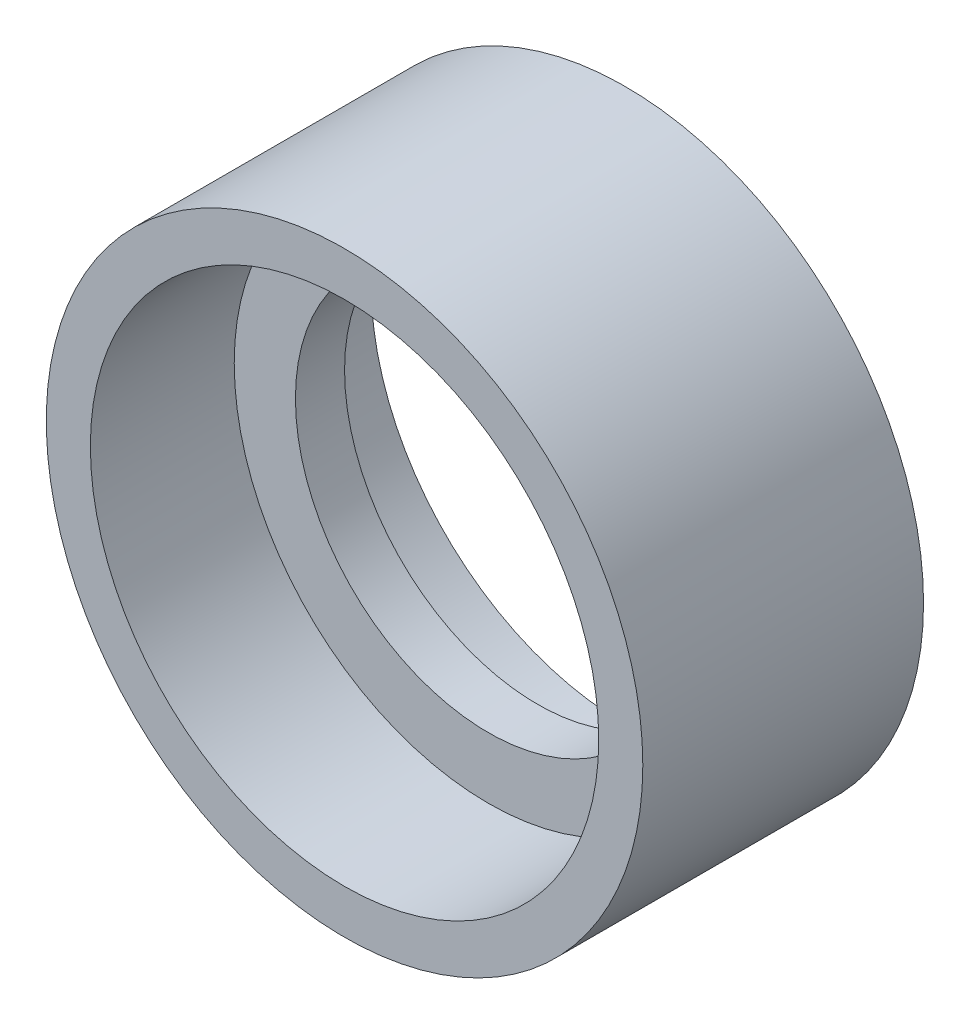
ISO-10303-21;
HEADER;
FILE_DESCRIPTION(('STEP AP214'),'2;1');
FILE_NAME('part.step','',(''),(''),'','','');
FILE_SCHEMA(('AUTOMOTIVE_DESIGN { 1 0 10303 214 1 1 1 1 }'));
ENDSEC;
DATA;
#1=APPLICATION_CONTEXT('core data for automotive mechanical design processes');
#2=APPLICATION_PROTOCOL_DEFINITION('international standard','automotive_design',2000,#1);
#3=PRODUCT_CONTEXT('',#1,'mechanical');
#4=PRODUCT('Part','Part','',(#3));
#5=PRODUCT_RELATED_PRODUCT_CATEGORY('part','',(#4));
#6=PRODUCT_DEFINITION_FORMATION('','',#4);
#7=PRODUCT_DEFINITION_CONTEXT('part definition',#1,'design');
#8=PRODUCT_DEFINITION('design','',#6,#7);
#9=PRODUCT_DEFINITION_SHAPE('','',#8);
#10=(LENGTH_UNIT() NAMED_UNIT(*) SI_UNIT(.MILLI.,.METRE.));
#11=(NAMED_UNIT(*) PLANE_ANGLE_UNIT() SI_UNIT($,.RADIAN.));
#12=(NAMED_UNIT(*) SI_UNIT($,.STERADIAN.) SOLID_ANGLE_UNIT());
#13=UNCERTAINTY_MEASURE_WITH_UNIT(LENGTH_MEASURE(1.E-05),#10,'distance_accuracy_value','');
#14=(GEOMETRIC_REPRESENTATION_CONTEXT(3) GLOBAL_UNCERTAINTY_ASSIGNED_CONTEXT((#13)) GLOBAL_UNIT_ASSIGNED_CONTEXT((#10,
#11,#12)) REPRESENTATION_CONTEXT('',''));
#15=CARTESIAN_POINT('',(0.,0.,0.));
#16=DIRECTION('',(0.,0.,1.));
#17=DIRECTION('',(1.,0.,0.));
#18=AXIS2_PLACEMENT_3D('',#15,#16,#17);
#19=CARTESIAN_POINT('',(0.,0.,12.7));
#20=DIRECTION('',(0.,0.,-1.));
#21=DIRECTION('',(-1.,0.,0.));
#22=AXIS2_PLACEMENT_3D('',#19,#20,#21);
#23=CYLINDRICAL_SURFACE('',#22,11.5);
#24=CARTESIAN_POINT('',(0.,0.,12.7));
#25=DIRECTION('',(0.,0.,-1.));
#26=DIRECTION('',(-1.,0.,0.));
#27=AXIS2_PLACEMENT_3D('',#24,#25,#26);
#28=CIRCLE('',#27,11.5);
#29=CARTESIAN_POINT('',(-11.5,0.,12.7));
#30=VERTEX_POINT('',#29);
#31=EDGE_CURVE('E51',#30,#30,#28,.T.);
#32=ORIENTED_EDGE('',*,*,#31,.F.);
#33=EDGE_LOOP('',(#32));
#34=FACE_BOUND('',#33,.T.);
#35=CARTESIAN_POINT('',(0.,0.,6.19125));
#36=DIRECTION('',(0.,0.,-1.));
#37=DIRECTION('',(-1.,0.,0.));
#38=AXIS2_PLACEMENT_3D('',#35,#36,#37);
#39=CIRCLE('',#38,11.5);
#40=CARTESIAN_POINT('',(-11.5,0.,6.19125));
#41=VERTEX_POINT('',#40);
#42=EDGE_CURVE('E10',#41,#41,#39,.F.);
#43=ORIENTED_EDGE('',*,*,#42,.F.);
#44=EDGE_LOOP('',(#43));
#45=FACE_BOUND('',#44,.T.);
#46=ADVANCED_FACE('F35',(#34,#45),#23,.F.);
#47=CARTESIAN_POINT('',(0.,0.,12.7));
#48=DIRECTION('',(0.,0.,-1.));
#49=DIRECTION('',(-1.,0.,0.));
#50=AXIS2_PLACEMENT_3D('',#47,#48,#49);
#51=CYLINDRICAL_SURFACE('',#50,13.49375);
#52=CARTESIAN_POINT('',(0.,0.,12.7));
#53=DIRECTION('',(0.,0.,1.));
#54=DIRECTION('',(1.,0.,0.));
#55=AXIS2_PLACEMENT_3D('',#52,#53,#54);
#56=CIRCLE('',#55,13.49375);
#57=CARTESIAN_POINT('',(13.49375,0.,12.7));
#58=VERTEX_POINT('',#57);
#59=EDGE_CURVE('E43',#58,#58,#56,.T.);
#60=ORIENTED_EDGE('',*,*,#59,.F.);
#61=EDGE_LOOP('',(#60));
#62=FACE_BOUND('',#61,.T.);
#63=CARTESIAN_POINT('',(0.,0.,0.));
#64=DIRECTION('',(0.,0.,1.));
#65=DIRECTION('',(1.,0.,0.));
#66=AXIS2_PLACEMENT_3D('',#63,#64,#65);
#67=CIRCLE('',#66,13.49375);
#68=CARTESIAN_POINT('',(13.49375,0.,0.));
#69=VERTEX_POINT('',#68);
#70=EDGE_CURVE('E47',#69,#69,#67,.T.);
#71=ORIENTED_EDGE('',*,*,#70,.T.);
#72=EDGE_LOOP('',(#71));
#73=FACE_BOUND('',#72,.T.);
#74=ADVANCED_FACE('F37',(#62,#73),#51,.T.);
#75=CARTESIAN_POINT('',(0.,0.,12.7));
#76=DIRECTION('',(0.,0.,1.));
#77=DIRECTION('',(1.,0.,0.));
#78=AXIS2_PLACEMENT_3D('',#75,#76,#77);
#79=PLANE('',#78);
#80=ORIENTED_EDGE('',*,*,#31,.T.);
#81=EDGE_LOOP('',(#80));
#82=FACE_BOUND('',#81,.T.);
#83=ORIENTED_EDGE('',*,*,#59,.T.);
#84=EDGE_LOOP('',(#83));
#85=FACE_BOUND('',#84,.T.);
#86=ADVANCED_FACE('F86',(#82,#85),#79,.T.);
#87=CARTESIAN_POINT('',(0.,0.,0.));
#88=DIRECTION('',(0.,0.,1.));
#89=DIRECTION('',(1.,0.,0.));
#90=AXIS2_PLACEMENT_3D('',#87,#88,#89);
#91=PLANE('',#90);
#92=CARTESIAN_POINT('',(0.,0.,0.));
#93=DIRECTION('',(0.,0.,-1.));
#94=DIRECTION('',(-1.,0.,0.));
#95=AXIS2_PLACEMENT_3D('',#92,#93,#94);
#96=CIRCLE('',#95,11.5);
#97=CARTESIAN_POINT('',(-11.5,0.,0.));
#98=VERTEX_POINT('',#97);
#99=EDGE_CURVE('E53',#98,#98,#96,.T.);
#100=ORIENTED_EDGE('',*,*,#99,.F.);
#101=EDGE_LOOP('',(#100));
#102=FACE_BOUND('',#101,.T.);
#103=ORIENTED_EDGE('',*,*,#70,.F.);
#104=EDGE_LOOP('',(#103));
#105=FACE_BOUND('',#104,.T.);
#106=ADVANCED_FACE('F80',(#102,#105),#91,.F.);
#107=CARTESIAN_POINT('',(0.,0.,3.96875));
#108=DIRECTION('',(0.,0.,-1.));
#109=DIRECTION('',(-1.,0.,0.));
#110=AXIS2_PLACEMENT_3D('',#107,#108,#109);
#111=CIRCLE('',#110,11.5);
#112=CARTESIAN_POINT('',(-11.5,0.,3.96875));
#113=VERTEX_POINT('',#112);
#114=EDGE_CURVE('E56',#113,#113,#111,.T.);
#115=ORIENTED_EDGE('',*,*,#114,.F.);
#116=EDGE_LOOP('',(#115));
#117=FACE_BOUND('',#116,.T.);
#118=ORIENTED_EDGE('',*,*,#99,.T.);
#119=EDGE_LOOP('',(#118));
#120=FACE_BOUND('',#119,.T.);
#121=ADVANCED_FACE('F74',(#117,#120),#23,.F.);
#122=CARTESIAN_POINT('',(0.,0.,3.96875));
#123=DIRECTION('',(0.,0.,-1.));
#124=DIRECTION('',(-1.,0.,0.));
#125=AXIS2_PLACEMENT_3D('',#122,#123,#124);
#126=PLANE('',#125);
#127=CARTESIAN_POINT('',(0.,0.,3.96875));
#128=DIRECTION('',(0.,0.,-1.));
#129=DIRECTION('',(-1.,0.,0.));
#130=AXIS2_PLACEMENT_3D('',#127,#128,#129);
#131=CIRCLE('',#130,8.73125);
#132=CARTESIAN_POINT('',(-8.73125,0.,3.96875));
#133=VERTEX_POINT('',#132);
#134=EDGE_CURVE('E39',#133,#133,#131,.T.);
#135=ORIENTED_EDGE('',*,*,#134,.F.);
#136=EDGE_LOOP('',(#135));
#137=FACE_BOUND('',#136,.T.);
#138=ORIENTED_EDGE('',*,*,#114,.T.);
#139=EDGE_LOOP('',(#138));
#140=FACE_BOUND('',#139,.T.);
#141=ADVANCED_FACE('F70',(#137,#140),#126,.T.);
#142=CARTESIAN_POINT('',(0.,0.,6.19125));
#143=DIRECTION('',(0.,0.,-1.));
#144=DIRECTION('',(-1.,0.,0.));
#145=AXIS2_PLACEMENT_3D('',#142,#143,#144);
#146=PLANE('',#145);
#147=CARTESIAN_POINT('',(0.,0.,6.19125));
#148=DIRECTION('',(0.,0.,1.));
#149=DIRECTION('',(1.,0.,0.));
#150=AXIS2_PLACEMENT_3D('',#147,#148,#149);
#151=CIRCLE('',#150,8.73125);
#152=CARTESIAN_POINT('',(8.73125,0.,6.19125));
#153=VERTEX_POINT('',#152);
#154=EDGE_CURVE('E61',#153,#153,#151,.T.);
#155=ORIENTED_EDGE('',*,*,#154,.F.);
#156=EDGE_LOOP('',(#155));
#157=FACE_BOUND('',#156,.T.);
#158=ORIENTED_EDGE('',*,*,#42,.T.);
#159=EDGE_LOOP('',(#158));
#160=FACE_BOUND('',#159,.T.);
#161=ADVANCED_FACE('F73',(#157,#160),#146,.F.);
#162=CARTESIAN_POINT('',(0.,0.,0.));
#163=DIRECTION('',(0.,0.,1.));
#164=DIRECTION('',(1.,0.,0.));
#165=AXIS2_PLACEMENT_3D('',#162,#163,#164);
#166=CYLINDRICAL_SURFACE('',#165,8.73125);
#167=ORIENTED_EDGE('',*,*,#134,.T.);
#168=EDGE_LOOP('',(#167));
#169=FACE_BOUND('',#168,.T.);
#170=ORIENTED_EDGE('',*,*,#154,.T.);
#171=EDGE_LOOP('',(#170));
#172=FACE_BOUND('',#171,.T.);
#173=ADVANCED_FACE('F68',(#169,#172),#166,.F.);
#174=CLOSED_SHELL('',(#46,#74,#86,#106,#121,#141,#161,#173));
#175=MANIFOLD_SOLID_BREP('B2',#174);
#176=ADVANCED_BREP_SHAPE_REPRESENTATION('',(#18,#175),#14);
#177=SHAPE_DEFINITION_REPRESENTATION(#9,#176);
ENDSEC;
END-ISO-10303-21;
